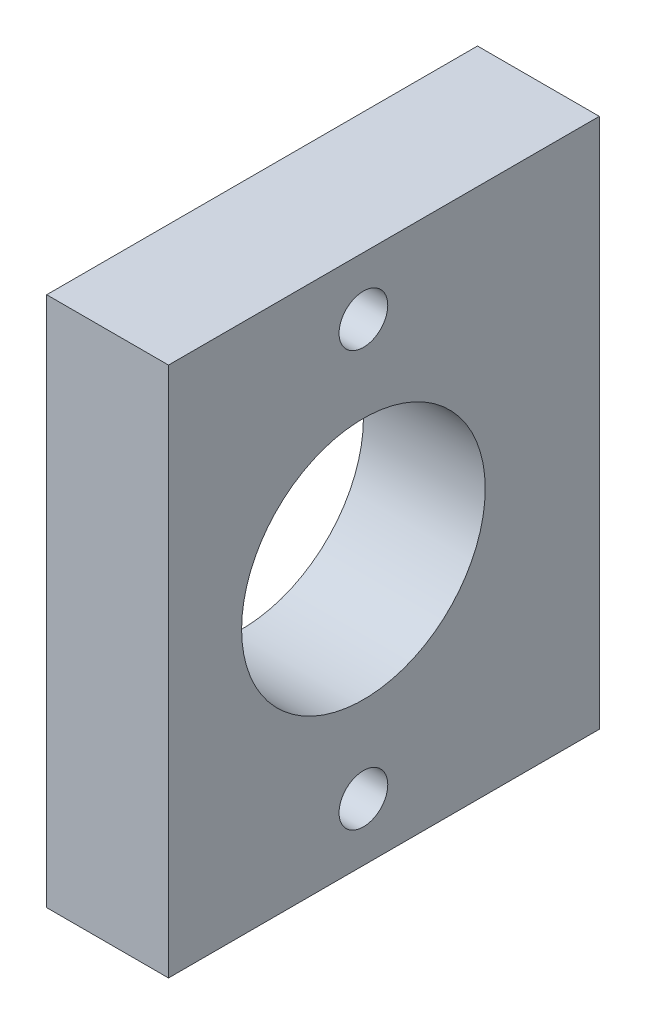
ISO-10303-21;
HEADER;
FILE_DESCRIPTION(('STEP AP214'),'2;1');
FILE_NAME('part.step','',(''),(''),'','','');
FILE_SCHEMA(('AUTOMOTIVE_DESIGN { 1 0 10303 214 1 1 1 1 }'));
ENDSEC;
DATA;
#1=APPLICATION_CONTEXT('core data for automotive mechanical design processes');
#2=APPLICATION_PROTOCOL_DEFINITION('international standard','automotive_design',2000,#1);
#3=PRODUCT_CONTEXT('',#1,'mechanical');
#4=PRODUCT('Part','Part','',(#3));
#5=PRODUCT_RELATED_PRODUCT_CATEGORY('part','',(#4));
#6=PRODUCT_DEFINITION_FORMATION('','',#4);
#7=PRODUCT_DEFINITION_CONTEXT('part definition',#1,'design');
#8=PRODUCT_DEFINITION('design','',#6,#7);
#9=PRODUCT_DEFINITION_SHAPE('','',#8);
#10=(LENGTH_UNIT() NAMED_UNIT(*) SI_UNIT(.MILLI.,.METRE.));
#11=(NAMED_UNIT(*) PLANE_ANGLE_UNIT() SI_UNIT($,.RADIAN.));
#12=(NAMED_UNIT(*) SI_UNIT($,.STERADIAN.) SOLID_ANGLE_UNIT());
#13=UNCERTAINTY_MEASURE_WITH_UNIT(LENGTH_MEASURE(1.E-05),#10,'distance_accuracy_value','');
#14=(GEOMETRIC_REPRESENTATION_CONTEXT(3) GLOBAL_UNCERTAINTY_ASSIGNED_CONTEXT((#13)) GLOBAL_UNIT_ASSIGNED_CONTEXT((#10,
#11,#12)) REPRESENTATION_CONTEXT('',''));
#15=CARTESIAN_POINT('',(0.,0.,0.));
#16=DIRECTION('',(0.,0.,1.));
#17=DIRECTION('',(1.,0.,0.));
#18=AXIS2_PLACEMENT_3D('',#15,#16,#17);
#19=CARTESIAN_POINT('',(91.0997248882145,0.,0.));
#20=DIRECTION('',(1.,0.,0.));
#21=DIRECTION('',(0.,0.,-1.));
#22=AXIS2_PLACEMENT_3D('',#19,#20,#21);
#23=PLANE('',#22);
#24=CARTESIAN_POINT('',(91.0997248882145,42.1099278691274,104.016306215624));
#25=DIRECTION('',(1.,0.,0.));
#26=DIRECTION('',(0.,0.,-1.));
#27=AXIS2_PLACEMENT_3D('',#24,#25,#26);
#28=CIRCLE('',#27,5.);
#29=CARTESIAN_POINT('',(91.0997248882145,42.1099278691274,99.0163062156238));
#30=VERTEX_POINT('',#29);
#31=EDGE_CURVE('E115',#30,#30,#28,.T.);
#32=ORIENTED_EDGE('',*,*,#31,.F.);
#33=EDGE_LOOP('',(#32));
#34=FACE_BOUND('',#33,.T.);
#35=DIRECTION('',(0.,0.,1.));
#36=VECTOR('',#35,1.);
#37=CARTESIAN_POINT('',(91.0997248882145,53.0037967306528,94.333625186025));
#38=LINE('',#37,#36);
#39=CARTESIAN_POINT('',(91.0997248882145,53.0037967306528,94.333625186025));
#40=VERTEX_POINT('',#39);
#41=CARTESIAN_POINT('',(91.0997248882145,53.0037967306528,112.016306215624));
#42=VERTEX_POINT('',#41);
#43=EDGE_CURVE('E85',#40,#42,#38,.T.);
#44=ORIENTED_EDGE('',*,*,#43,.T.);
#45=DIRECTION('',(0.,-1.,0.));
#46=VECTOR('',#45,1.);
#47=CARTESIAN_POINT('',(91.0997248882145,53.0037967306528,112.016306215624));
#48=LINE('',#47,#46);
#49=CARTESIAN_POINT('',(91.0997248882145,31.216059007602,112.016306215624));
#50=VERTEX_POINT('',#49);
#51=EDGE_CURVE('E80',#42,#50,#48,.T.);
#52=ORIENTED_EDGE('',*,*,#51,.T.);
#53=DIRECTION('',(0.,0.,-1.));
#54=VECTOR('',#53,1.);
#55=CARTESIAN_POINT('',(91.0997248882145,31.216059007602,112.016306215624));
#56=LINE('',#55,#54);
#57=CARTESIAN_POINT('',(91.0997248882145,31.216059007602,94.333625186025));
#58=VERTEX_POINT('',#57);
#59=EDGE_CURVE('E83',#50,#58,#56,.T.);
#60=ORIENTED_EDGE('',*,*,#59,.T.);
#61=DIRECTION('',(0.,1.,0.));
#62=VECTOR('',#61,1.);
#63=CARTESIAN_POINT('',(91.0997248882145,31.216059007602,94.333625186025));
#64=LINE('',#63,#62);
#65=EDGE_CURVE('E50',#58,#40,#64,.T.);
#66=ORIENTED_EDGE('',*,*,#65,.T.);
#67=EDGE_LOOP('',(#44,#52,#60,#66));
#68=FACE_BOUND('',#67,.T.);
#69=CARTESIAN_POINT('',(91.0997248882145,50.6320240397967,104.016306215624));
#70=DIRECTION('',(1.,0.,0.));
#71=DIRECTION('',(0.,0.,-1.));
#72=AXIS2_PLACEMENT_3D('',#69,#70,#71);
#73=CIRCLE('',#72,0.999999999999998);
#74=CARTESIAN_POINT('',(91.0997248882145,50.6320240397967,103.016306215624));
#75=VERTEX_POINT('',#74);
#76=EDGE_CURVE('E100',#75,#75,#73,.T.);
#77=ORIENTED_EDGE('',*,*,#76,.F.);
#78=EDGE_LOOP('',(#77));
#79=FACE_BOUND('',#78,.T.);
#80=CARTESIAN_POINT('',(91.0997248882145,33.5878316984582,104.016306215624));
#81=DIRECTION('',(1.,0.,0.));
#82=DIRECTION('',(0.,0.,-1.));
#83=AXIS2_PLACEMENT_3D('',#80,#81,#82);
#84=CIRCLE('',#83,0.999999999999998);
#85=CARTESIAN_POINT('',(91.0997248882145,33.5878316984582,103.016306215624));
#86=VERTEX_POINT('',#85);
#87=EDGE_CURVE('E121',#86,#86,#84,.T.);
#88=ORIENTED_EDGE('',*,*,#87,.F.);
#89=EDGE_LOOP('',(#88));
#90=FACE_BOUND('',#89,.T.);
#91=ADVANCED_FACE('F33',(#34,#68,#79,#90),#23,.T.);
#92=CARTESIAN_POINT('',(86.0997248882145,0.,0.));
#93=DIRECTION('',(1.,0.,0.));
#94=DIRECTION('',(0.,0.,-1.));
#95=AXIS2_PLACEMENT_3D('',#92,#93,#94);
#96=PLANE('',#95);
#97=DIRECTION('',(0.,0.,1.));
#98=VECTOR('',#97,1.);
#99=CARTESIAN_POINT('',(86.0997248882145,53.0037967306528,94.333625186025));
#100=LINE('',#99,#98);
#101=CARTESIAN_POINT('',(86.0997248882145,53.0037967306528,94.333625186025));
#102=VERTEX_POINT('',#101);
#103=CARTESIAN_POINT('',(86.0997248882145,53.0037967306528,112.016306215624));
#104=VERTEX_POINT('',#103);
#105=EDGE_CURVE('E97',#102,#104,#100,.T.);
#106=ORIENTED_EDGE('',*,*,#105,.F.);
#107=DIRECTION('',(0.,1.,0.));
#108=VECTOR('',#107,1.);
#109=CARTESIAN_POINT('',(86.0997248882145,31.216059007602,94.333625186025));
#110=LINE('',#109,#108);
#111=CARTESIAN_POINT('',(86.0997248882145,31.216059007602,94.333625186025));
#112=VERTEX_POINT('',#111);
#113=EDGE_CURVE('E73',#112,#102,#110,.T.);
#114=ORIENTED_EDGE('',*,*,#113,.F.);
#115=DIRECTION('',(0.,0.,-1.));
#116=VECTOR('',#115,1.);
#117=CARTESIAN_POINT('',(86.0997248882145,31.216059007602,112.016306215624));
#118=LINE('',#117,#116);
#119=CARTESIAN_POINT('',(86.0997248882145,31.216059007602,112.016306215624));
#120=VERTEX_POINT('',#119);
#121=EDGE_CURVE('E67',#120,#112,#118,.T.);
#122=ORIENTED_EDGE('',*,*,#121,.F.);
#123=DIRECTION('',(0.,-1.,0.));
#124=VECTOR('',#123,1.);
#125=CARTESIAN_POINT('',(86.0997248882145,53.0037967306528,112.016306215624));
#126=LINE('',#125,#124);
#127=EDGE_CURVE('E89',#104,#120,#126,.T.);
#128=ORIENTED_EDGE('',*,*,#127,.F.);
#129=EDGE_LOOP('',(#106,#114,#122,#128));
#130=FACE_BOUND('',#129,.T.);
#131=CARTESIAN_POINT('',(86.0997248882145,50.6320240397967,104.016306215624));
#132=DIRECTION('',(1.,0.,0.));
#133=DIRECTION('',(0.,0.,-1.));
#134=AXIS2_PLACEMENT_3D('',#131,#132,#133);
#135=CIRCLE('',#134,0.999999999999998);
#136=CARTESIAN_POINT('',(86.0997248882145,50.6320240397967,103.016306215624));
#137=VERTEX_POINT('',#136);
#138=EDGE_CURVE('E112',#137,#137,#135,.T.);
#139=ORIENTED_EDGE('',*,*,#138,.T.);
#140=EDGE_LOOP('',(#139));
#141=FACE_BOUND('',#140,.T.);
#142=CARTESIAN_POINT('',(86.0997248882145,42.1099278691274,104.016306215624));
#143=DIRECTION('',(1.,0.,0.));
#144=DIRECTION('',(0.,0.,-1.));
#145=AXIS2_PLACEMENT_3D('',#142,#143,#144);
#146=CIRCLE('',#145,5.);
#147=CARTESIAN_POINT('',(86.0997248882145,42.1099278691274,99.0163062156238));
#148=VERTEX_POINT('',#147);
#149=EDGE_CURVE('E118',#148,#148,#146,.T.);
#150=ORIENTED_EDGE('',*,*,#149,.T.);
#151=EDGE_LOOP('',(#150));
#152=FACE_BOUND('',#151,.T.);
#153=CARTESIAN_POINT('',(86.0997248882145,33.5878316984582,104.016306215624));
#154=DIRECTION('',(1.,0.,0.));
#155=DIRECTION('',(0.,0.,-1.));
#156=AXIS2_PLACEMENT_3D('',#153,#154,#155);
#157=CIRCLE('',#156,0.999999999999998);
#158=CARTESIAN_POINT('',(86.0997248882145,33.5878316984582,103.016306215624));
#159=VERTEX_POINT('',#158);
#160=EDGE_CURVE('E124',#159,#159,#157,.T.);
#161=ORIENTED_EDGE('',*,*,#160,.T.);
#162=EDGE_LOOP('',(#161));
#163=FACE_BOUND('',#162,.T.);
#164=ADVANCED_FACE('F108',(#130,#141,#152,#163),#96,.F.);
#165=CARTESIAN_POINT('',(91.0997248882145,53.0037967306528,94.333625186025));
#166=DIRECTION('',(0.,-1.,0.));
#167=DIRECTION('',(0.,0.,-1.));
#168=AXIS2_PLACEMENT_3D('',#165,#166,#167);
#169=PLANE('',#168);
#170=ORIENTED_EDGE('',*,*,#105,.T.);
#171=DIRECTION('',(-1.,0.,0.));
#172=VECTOR('',#171,1.);
#173=CARTESIAN_POINT('',(91.0997248882145,53.0037967306528,112.016306215624));
#174=LINE('',#173,#172);
#175=EDGE_CURVE('E11',#42,#104,#174,.T.);
#176=ORIENTED_EDGE('',*,*,#175,.F.);
#177=ORIENTED_EDGE('',*,*,#43,.F.);
#178=DIRECTION('',(-1.,0.,0.));
#179=VECTOR('',#178,1.);
#180=CARTESIAN_POINT('',(91.0997248882145,53.0037967306528,94.333625186025));
#181=LINE('',#180,#179);
#182=EDGE_CURVE('E93',#40,#102,#181,.T.);
#183=ORIENTED_EDGE('',*,*,#182,.T.);
#184=EDGE_LOOP('',(#170,#176,#177,#183));
#185=FACE_BOUND('',#184,.T.);
#186=ADVANCED_FACE('F35',(#185),#169,.F.);
#187=CARTESIAN_POINT('',(91.0997248882145,53.0037967306528,112.016306215624));
#188=DIRECTION('',(0.,0.,-1.));
#189=DIRECTION('',(-1.,0.,0.));
#190=AXIS2_PLACEMENT_3D('',#187,#188,#189);
#191=PLANE('',#190);
#192=ORIENTED_EDGE('',*,*,#127,.T.);
#193=DIRECTION('',(-1.,0.,0.));
#194=VECTOR('',#193,1.);
#195=CARTESIAN_POINT('',(91.0997248882145,31.216059007602,112.016306215624));
#196=LINE('',#195,#194);
#197=EDGE_CURVE('E42',#50,#120,#196,.T.);
#198=ORIENTED_EDGE('',*,*,#197,.F.);
#199=ORIENTED_EDGE('',*,*,#51,.F.);
#200=ORIENTED_EDGE('',*,*,#175,.T.);
#201=EDGE_LOOP('',(#192,#198,#199,#200));
#202=FACE_BOUND('',#201,.T.);
#203=ADVANCED_FACE('F88',(#202),#191,.F.);
#204=CARTESIAN_POINT('',(91.0997248882145,31.216059007602,112.016306215624));
#205=DIRECTION('',(0.,1.,0.));
#206=DIRECTION('',(0.,0.,1.));
#207=AXIS2_PLACEMENT_3D('',#204,#205,#206);
#208=PLANE('',#207);
#209=ORIENTED_EDGE('',*,*,#121,.T.);
#210=DIRECTION('',(-1.,0.,0.));
#211=VECTOR('',#210,1.);
#212=CARTESIAN_POINT('',(91.0997248882145,31.216059007602,94.333625186025));
#213=LINE('',#212,#211);
#214=EDGE_CURVE('E90',#58,#112,#213,.T.);
#215=ORIENTED_EDGE('',*,*,#214,.F.);
#216=ORIENTED_EDGE('',*,*,#59,.F.);
#217=ORIENTED_EDGE('',*,*,#197,.T.);
#218=EDGE_LOOP('',(#209,#215,#216,#217));
#219=FACE_BOUND('',#218,.T.);
#220=ADVANCED_FACE('F91',(#219),#208,.F.);
#221=CARTESIAN_POINT('',(91.0997248882145,31.216059007602,94.333625186025));
#222=DIRECTION('',(0.,0.,1.));
#223=DIRECTION('',(1.,0.,0.));
#224=AXIS2_PLACEMENT_3D('',#221,#222,#223);
#225=PLANE('',#224);
#226=ORIENTED_EDGE('',*,*,#113,.T.);
#227=ORIENTED_EDGE('',*,*,#182,.F.);
#228=ORIENTED_EDGE('',*,*,#65,.F.);
#229=ORIENTED_EDGE('',*,*,#214,.T.);
#230=EDGE_LOOP('',(#226,#227,#228,#229));
#231=FACE_BOUND('',#230,.T.);
#232=ADVANCED_FACE('F105',(#231),#225,.F.);
#233=CARTESIAN_POINT('',(91.0997248882145,50.6320240397967,104.016306215624));
#234=DIRECTION('',(-1.,0.,0.));
#235=DIRECTION('',(0.,0.,1.));
#236=AXIS2_PLACEMENT_3D('',#233,#234,#235);
#237=CYLINDRICAL_SURFACE('',#236,0.999999999999998);
#238=ORIENTED_EDGE('',*,*,#76,.T.);
#239=EDGE_LOOP('',(#238));
#240=FACE_BOUND('',#239,.T.);
#241=ORIENTED_EDGE('',*,*,#138,.F.);
#242=EDGE_LOOP('',(#241));
#243=FACE_BOUND('',#242,.T.);
#244=ADVANCED_FACE('F142',(#240,#243),#237,.F.);
#245=CARTESIAN_POINT('',(91.0997248882145,42.1099278691274,104.016306215624));
#246=DIRECTION('',(-1.,0.,0.));
#247=DIRECTION('',(0.,0.,1.));
#248=AXIS2_PLACEMENT_3D('',#245,#246,#247);
#249=CYLINDRICAL_SURFACE('',#248,5.);
#250=ORIENTED_EDGE('',*,*,#31,.T.);
#251=EDGE_LOOP('',(#250));
#252=FACE_BOUND('',#251,.T.);
#253=ORIENTED_EDGE('',*,*,#149,.F.);
#254=EDGE_LOOP('',(#253));
#255=FACE_BOUND('',#254,.T.);
#256=ADVANCED_FACE('F188',(#252,#255),#249,.F.);
#257=CARTESIAN_POINT('',(91.0997248882145,33.5878316984582,104.016306215624));
#258=DIRECTION('',(-1.,0.,0.));
#259=DIRECTION('',(0.,0.,1.));
#260=AXIS2_PLACEMENT_3D('',#257,#258,#259);
#261=CYLINDRICAL_SURFACE('',#260,0.999999999999998);
#262=ORIENTED_EDGE('',*,*,#87,.T.);
#263=EDGE_LOOP('',(#262));
#264=FACE_BOUND('',#263,.T.);
#265=ORIENTED_EDGE('',*,*,#160,.F.);
#266=EDGE_LOOP('',(#265));
#267=FACE_BOUND('',#266,.T.);
#268=ADVANCED_FACE('F130',(#264,#267),#261,.F.);
#269=CLOSED_SHELL('',(#91,#164,#186,#203,#220,#232,#244,#256,#268));
#270=MANIFOLD_SOLID_BREP('B2',#269);
#271=ADVANCED_BREP_SHAPE_REPRESENTATION('',(#18,#270),#14);
#272=SHAPE_DEFINITION_REPRESENTATION(#9,#271);
ENDSEC;
END-ISO-10303-21;
